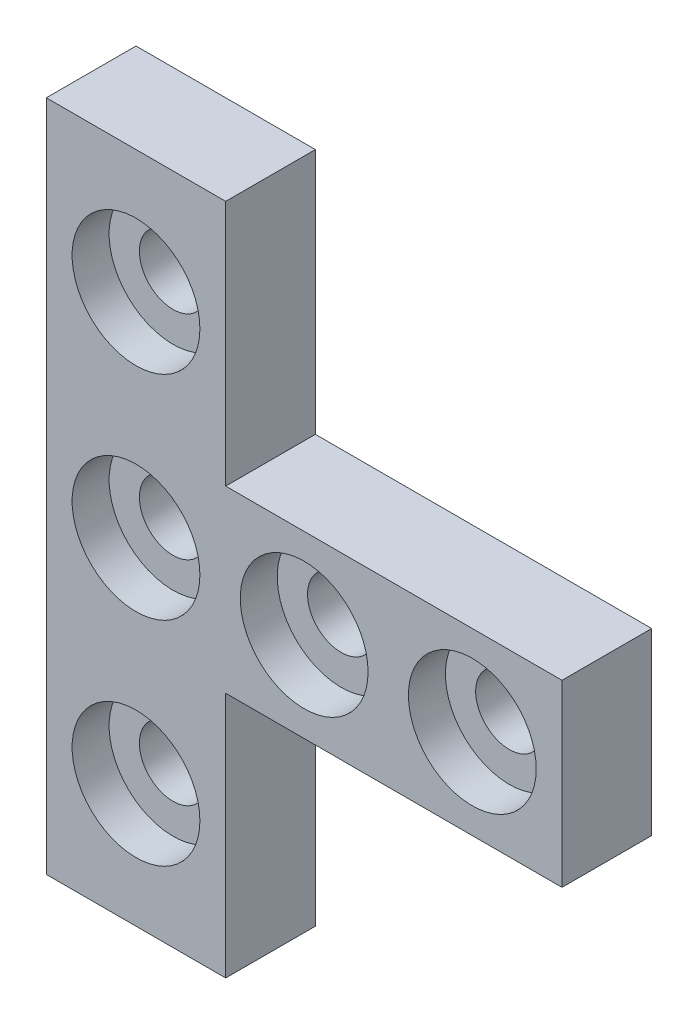
ISO-10303-21;
HEADER;
FILE_DESCRIPTION(('STEP AP214'),'2;1');
FILE_NAME('part.step','',(''),(''),'','','');
FILE_SCHEMA(('AUTOMOTIVE_DESIGN { 1 0 10303 214 1 1 1 1 }'));
ENDSEC;
DATA;
#1=APPLICATION_CONTEXT('core data for automotive mechanical design processes');
#2=APPLICATION_PROTOCOL_DEFINITION('international standard','automotive_design',2000,#1);
#3=PRODUCT_CONTEXT('',#1,'mechanical');
#4=PRODUCT('Part','Part','',(#3));
#5=PRODUCT_RELATED_PRODUCT_CATEGORY('part','',(#4));
#6=PRODUCT_DEFINITION_FORMATION('','',#4);
#7=PRODUCT_DEFINITION_CONTEXT('part definition',#1,'design');
#8=PRODUCT_DEFINITION('design','',#6,#7);
#9=PRODUCT_DEFINITION_SHAPE('','',#8);
#10=(LENGTH_UNIT() NAMED_UNIT(*) SI_UNIT(.MILLI.,.METRE.));
#11=(NAMED_UNIT(*) PLANE_ANGLE_UNIT() SI_UNIT($,.RADIAN.));
#12=(NAMED_UNIT(*) SI_UNIT($,.STERADIAN.) SOLID_ANGLE_UNIT());
#13=UNCERTAINTY_MEASURE_WITH_UNIT(LENGTH_MEASURE(1.E-05),#10,'distance_accuracy_value','');
#14=(GEOMETRIC_REPRESENTATION_CONTEXT(3) GLOBAL_UNCERTAINTY_ASSIGNED_CONTEXT((#13)) GLOBAL_UNIT_ASSIGNED_CONTEXT((#10,
#11,#12)) REPRESENTATION_CONTEXT('',''));
#15=CARTESIAN_POINT('',(0.,0.,0.));
#16=DIRECTION('',(0.,0.,1.));
#17=DIRECTION('',(1.,0.,0.));
#18=AXIS2_PLACEMENT_3D('',#15,#16,#17);
#19=CARTESIAN_POINT('',(49.9972172088586,-189.705431529691,4.));
#20=DIRECTION('',(0.,0.,-1.));
#21=DIRECTION('',(-1.,0.,0.));
#22=AXIS2_PLACEMENT_3D('',#19,#20,#21);
#23=CYLINDRICAL_SURFACE('',#22,1.5);
#24=CARTESIAN_POINT('',(49.9972172088586,-189.705431529691,0.));
#25=DIRECTION('',(0.,0.,1.));
#26=DIRECTION('',(1.,0.,0.));
#27=AXIS2_PLACEMENT_3D('',#24,#25,#26);
#28=CIRCLE('',#27,1.5);
#29=CARTESIAN_POINT('',(51.4972172088586,-189.705431529691,0.));
#30=VERTEX_POINT('',#29);
#31=EDGE_CURVE('E156',#30,#30,#28,.T.);
#32=ORIENTED_EDGE('',*,*,#31,.F.);
#33=EDGE_LOOP('',(#32));
#34=FACE_BOUND('',#33,.T.);
#35=CARTESIAN_POINT('',(49.9972172088586,-189.705431529691,2.35));
#36=DIRECTION('',(0.,0.,1.));
#37=DIRECTION('',(1.,0.,0.));
#38=AXIS2_PLACEMENT_3D('',#35,#36,#37);
#39=CIRCLE('',#38,1.5);
#40=CARTESIAN_POINT('',(51.4972172088586,-189.705431529691,2.35));
#41=VERTEX_POINT('',#40);
#42=EDGE_CURVE('E39',#41,#41,#39,.T.);
#43=ORIENTED_EDGE('',*,*,#42,.T.);
#44=EDGE_LOOP('',(#43));
#45=FACE_BOUND('',#44,.T.);
#46=ADVANCED_FACE('F35',(#34,#45),#23,.F.);
#47=CARTESIAN_POINT('',(42.4972172088585,-180.205431529691,4.));
#48=DIRECTION('',(0.,0.,-1.));
#49=DIRECTION('',(-1.,0.,0.));
#50=AXIS2_PLACEMENT_3D('',#47,#48,#49);
#51=CYLINDRICAL_SURFACE('',#50,1.5);
#52=CARTESIAN_POINT('',(42.4972172088585,-180.205431529691,0.));
#53=DIRECTION('',(0.,0.,1.));
#54=DIRECTION('',(1.,0.,0.));
#55=AXIS2_PLACEMENT_3D('',#52,#53,#54);
#56=CIRCLE('',#55,1.5);
#57=CARTESIAN_POINT('',(43.9972172088585,-180.205431529691,0.));
#58=VERTEX_POINT('',#57);
#59=EDGE_CURVE('E153',#58,#58,#56,.T.);
#60=ORIENTED_EDGE('',*,*,#59,.F.);
#61=EDGE_LOOP('',(#60));
#62=FACE_BOUND('',#61,.T.);
#63=CARTESIAN_POINT('',(42.4972172088585,-180.205431529691,2.35));
#64=DIRECTION('',(0.,0.,1.));
#65=DIRECTION('',(1.,0.,0.));
#66=AXIS2_PLACEMENT_3D('',#63,#64,#65);
#67=CIRCLE('',#66,1.5);
#68=CARTESIAN_POINT('',(43.9972172088585,-180.205431529691,2.35));
#69=VERTEX_POINT('',#68);
#70=EDGE_CURVE('E182',#69,#69,#67,.T.);
#71=ORIENTED_EDGE('',*,*,#70,.T.);
#72=EDGE_LOOP('',(#71));
#73=FACE_BOUND('',#72,.T.);
#74=ADVANCED_FACE('F254',(#62,#73),#51,.F.);
#75=CARTESIAN_POINT('',(42.4972172088585,-199.205431529692,4.));
#76=DIRECTION('',(0.,0.,-1.));
#77=DIRECTION('',(-1.,0.,0.));
#78=AXIS2_PLACEMENT_3D('',#75,#76,#77);
#79=CYLINDRICAL_SURFACE('',#78,1.5);
#80=CARTESIAN_POINT('',(42.4972172088585,-199.205431529692,0.));
#81=DIRECTION('',(0.,0.,1.));
#82=DIRECTION('',(1.,0.,0.));
#83=AXIS2_PLACEMENT_3D('',#80,#81,#82);
#84=CIRCLE('',#83,1.5);
#85=CARTESIAN_POINT('',(43.9972172088585,-199.205431529692,0.));
#86=VERTEX_POINT('',#85);
#87=EDGE_CURVE('E150',#86,#86,#84,.T.);
#88=ORIENTED_EDGE('',*,*,#87,.F.);
#89=EDGE_LOOP('',(#88));
#90=FACE_BOUND('',#89,.T.);
#91=CARTESIAN_POINT('',(42.4972172088585,-199.205431529692,2.35));
#92=DIRECTION('',(0.,0.,1.));
#93=DIRECTION('',(1.,0.,0.));
#94=AXIS2_PLACEMENT_3D('',#91,#92,#93);
#95=CIRCLE('',#94,1.5);
#96=CARTESIAN_POINT('',(43.9972172088585,-199.205431529692,2.35));
#97=VERTEX_POINT('',#96);
#98=EDGE_CURVE('E180',#97,#97,#95,.T.);
#99=ORIENTED_EDGE('',*,*,#98,.T.);
#100=EDGE_LOOP('',(#99));
#101=FACE_BOUND('',#100,.T.);
#102=ADVANCED_FACE('F260',(#90,#101),#79,.F.);
#103=CARTESIAN_POINT('',(42.4972172088586,-189.705431529691,4.));
#104=DIRECTION('',(0.,0.,-1.));
#105=DIRECTION('',(-1.,0.,0.));
#106=AXIS2_PLACEMENT_3D('',#103,#104,#105);
#107=CYLINDRICAL_SURFACE('',#106,1.5);
#108=CARTESIAN_POINT('',(42.4972172088586,-189.705431529691,0.));
#109=DIRECTION('',(0.,0.,1.));
#110=DIRECTION('',(1.,0.,0.));
#111=AXIS2_PLACEMENT_3D('',#108,#109,#110);
#112=CIRCLE('',#111,1.5);
#113=CARTESIAN_POINT('',(43.9972172088586,-189.705431529691,0.));
#114=VERTEX_POINT('',#113);
#115=EDGE_CURVE('E147',#114,#114,#112,.T.);
#116=ORIENTED_EDGE('',*,*,#115,.F.);
#117=EDGE_LOOP('',(#116));
#118=FACE_BOUND('',#117,.T.);
#119=CARTESIAN_POINT('',(42.4972172088586,-189.705431529691,2.35));
#120=DIRECTION('',(0.,0.,1.));
#121=DIRECTION('',(1.,0.,0.));
#122=AXIS2_PLACEMENT_3D('',#119,#120,#121);
#123=CIRCLE('',#122,1.5);
#124=CARTESIAN_POINT('',(43.9972172088586,-189.705431529691,2.35));
#125=VERTEX_POINT('',#124);
#126=EDGE_CURVE('E176',#125,#125,#123,.T.);
#127=ORIENTED_EDGE('',*,*,#126,.T.);
#128=EDGE_LOOP('',(#127));
#129=FACE_BOUND('',#128,.T.);
#130=ADVANCED_FACE('F270',(#118,#129),#107,.F.);
#131=CARTESIAN_POINT('',(57.4972172088586,-189.705431529691,4.));
#132=DIRECTION('',(0.,0.,-1.));
#133=DIRECTION('',(-1.,0.,0.));
#134=AXIS2_PLACEMENT_3D('',#131,#132,#133);
#135=CYLINDRICAL_SURFACE('',#134,1.5);
#136=CARTESIAN_POINT('',(57.4972172088586,-189.705431529691,0.));
#137=DIRECTION('',(0.,0.,1.));
#138=DIRECTION('',(1.,0.,0.));
#139=AXIS2_PLACEMENT_3D('',#136,#137,#138);
#140=CIRCLE('',#139,1.5);
#141=CARTESIAN_POINT('',(58.9972172088586,-189.705431529691,0.));
#142=VERTEX_POINT('',#141);
#143=EDGE_CURVE('E159',#142,#142,#140,.T.);
#144=ORIENTED_EDGE('',*,*,#143,.F.);
#145=EDGE_LOOP('',(#144));
#146=FACE_BOUND('',#145,.T.);
#147=CARTESIAN_POINT('',(57.4972172088586,-189.705431529691,2.35));
#148=DIRECTION('',(0.,0.,1.));
#149=DIRECTION('',(1.,0.,0.));
#150=AXIS2_PLACEMENT_3D('',#147,#148,#149);
#151=CIRCLE('',#150,1.5);
#152=CARTESIAN_POINT('',(58.9972172088586,-189.705431529691,2.35));
#153=VERTEX_POINT('',#152);
#154=EDGE_CURVE('E173',#153,#153,#151,.T.);
#155=ORIENTED_EDGE('',*,*,#154,.T.);
#156=EDGE_LOOP('',(#155));
#157=FACE_BOUND('',#156,.T.);
#158=ADVANCED_FACE('F265',(#146,#157),#135,.F.);
#159=CARTESIAN_POINT('',(3.43624076470357E-13,-185.705431529692,4.));
#160=DIRECTION('',(0.,1.,0.));
#161=DIRECTION('',(-1.,0.,0.));
#162=AXIS2_PLACEMENT_3D('',#159,#160,#161);
#163=PLANE('',#162);
#164=DIRECTION('',(1.,0.,0.));
#165=VECTOR('',#164,1.);
#166=CARTESIAN_POINT('',(3.43624076470357E-13,-185.705431529692,0.));
#167=LINE('',#166,#165);
#168=CARTESIAN_POINT('',(46.4972172088586,-185.705431529692,0.));
#169=VERTEX_POINT('',#168);
#170=CARTESIAN_POINT('',(61.4972172088586,-185.705431529691,0.));
#171=VERTEX_POINT('',#170);
#172=EDGE_CURVE('E130',#169,#171,#167,.T.);
#173=ORIENTED_EDGE('',*,*,#172,.F.);
#174=DIRECTION('',(0.,0.,-1.));
#175=VECTOR('',#174,1.);
#176=CARTESIAN_POINT('',(46.4972172088586,-185.705431529692,4.));
#177=LINE('',#176,#175);
#178=CARTESIAN_POINT('',(46.4972172088586,-185.705431529692,4.));
#179=VERTEX_POINT('',#178);
#180=EDGE_CURVE('E11',#179,#169,#177,.T.);
#181=ORIENTED_EDGE('',*,*,#180,.F.);
#182=DIRECTION('',(1.,0.,0.));
#183=VECTOR('',#182,1.);
#184=CARTESIAN_POINT('',(3.43624076470357E-13,-185.705431529692,4.));
#185=LINE('',#184,#183);
#186=CARTESIAN_POINT('',(61.4972172088586,-185.705431529691,4.));
#187=VERTEX_POINT('',#186);
#188=EDGE_CURVE('E162',#179,#187,#185,.T.);
#189=ORIENTED_EDGE('',*,*,#188,.T.);
#190=DIRECTION('',(0.,0.,-1.));
#191=VECTOR('',#190,1.);
#192=CARTESIAN_POINT('',(61.4972172088586,-185.705431529691,4.));
#193=LINE('',#192,#191);
#194=EDGE_CURVE('E89',#187,#171,#193,.T.);
#195=ORIENTED_EDGE('',*,*,#194,.T.);
#196=EDGE_LOOP('',(#173,#181,#189,#195));
#197=FACE_BOUND('',#196,.T.);
#198=ADVANCED_FACE('F37',(#197),#163,.T.);
#199=CARTESIAN_POINT('',(46.4972172088586,0.,4.));
#200=DIRECTION('',(-1.,0.,0.));
#201=DIRECTION('',(0.,0.,1.));
#202=AXIS2_PLACEMENT_3D('',#199,#200,#201);
#203=PLANE('',#202);
#204=DIRECTION('',(0.,1.,0.));
#205=VECTOR('',#204,1.);
#206=CARTESIAN_POINT('',(46.4972172088586,0.,0.));
#207=LINE('',#206,#205);
#208=CARTESIAN_POINT('',(46.4972172088584,-174.705431529691,0.));
#209=VERTEX_POINT('',#208);
#210=EDGE_CURVE('E133',#169,#209,#207,.T.);
#211=ORIENTED_EDGE('',*,*,#210,.T.);
#212=DIRECTION('',(0.,0.,-1.));
#213=VECTOR('',#212,1.);
#214=CARTESIAN_POINT('',(46.4972172088584,-174.705431529691,4.));
#215=LINE('',#214,#213);
#216=CARTESIAN_POINT('',(46.4972172088584,-174.705431529691,4.));
#217=VERTEX_POINT('',#216);
#218=EDGE_CURVE('E45',#217,#209,#215,.T.);
#219=ORIENTED_EDGE('',*,*,#218,.F.);
#220=DIRECTION('',(0.,1.,0.));
#221=VECTOR('',#220,1.);
#222=CARTESIAN_POINT('',(46.4972172088586,0.,4.));
#223=LINE('',#222,#221);
#224=EDGE_CURVE('E217',#179,#217,#223,.T.);
#225=ORIENTED_EDGE('',*,*,#224,.F.);
#226=ORIENTED_EDGE('',*,*,#180,.T.);
#227=EDGE_LOOP('',(#211,#219,#225,#226));
#228=FACE_BOUND('',#227,.T.);
#229=ADVANCED_FACE('F238',(#228),#203,.F.);
#230=CARTESIAN_POINT('',(0.,-174.705431529691,4.));
#231=DIRECTION('',(0.,-1.,0.));
#232=DIRECTION('',(0.,0.,-1.));
#233=AXIS2_PLACEMENT_3D('',#230,#231,#232);
#234=PLANE('',#233);
#235=DIRECTION('',(-1.,0.,0.));
#236=VECTOR('',#235,1.);
#237=CARTESIAN_POINT('',(0.,-174.705431529691,0.));
#238=LINE('',#237,#236);
#239=CARTESIAN_POINT('',(38.4972172088586,-174.705431529691,0.));
#240=VERTEX_POINT('',#239);
#241=EDGE_CURVE('E135',#209,#240,#238,.T.);
#242=ORIENTED_EDGE('',*,*,#241,.T.);
#243=DIRECTION('',(0.,0.,-1.));
#244=VECTOR('',#243,1.);
#245=CARTESIAN_POINT('',(38.4972172088586,-174.705431529691,4.));
#246=LINE('',#245,#244);
#247=CARTESIAN_POINT('',(38.4972172088586,-174.705431529691,4.));
#248=VERTEX_POINT('',#247);
#249=EDGE_CURVE('E168',#248,#240,#246,.T.);
#250=ORIENTED_EDGE('',*,*,#249,.F.);
#251=DIRECTION('',(-1.,0.,0.));
#252=VECTOR('',#251,1.);
#253=CARTESIAN_POINT('',(0.,-174.705431529691,4.));
#254=LINE('',#253,#252);
#255=EDGE_CURVE('E219',#217,#248,#254,.T.);
#256=ORIENTED_EDGE('',*,*,#255,.F.);
#257=ORIENTED_EDGE('',*,*,#218,.T.);
#258=EDGE_LOOP('',(#242,#250,#256,#257));
#259=FACE_BOUND('',#258,.T.);
#260=ADVANCED_FACE('F241',(#259),#234,.F.);
#261=CARTESIAN_POINT('',(38.4972172088584,0.,4.));
#262=DIRECTION('',(1.,0.,0.));
#263=DIRECTION('',(0.,1.,0.));
#264=AXIS2_PLACEMENT_3D('',#261,#262,#263);
#265=PLANE('',#264);
#266=DIRECTION('',(0.,-1.,0.));
#267=VECTOR('',#266,1.);
#268=CARTESIAN_POINT('',(38.4972172088584,0.,0.));
#269=LINE('',#268,#267);
#270=CARTESIAN_POINT('',(38.4972172088586,-204.705431529692,0.));
#271=VERTEX_POINT('',#270);
#272=EDGE_CURVE('E137',#240,#271,#269,.T.);
#273=ORIENTED_EDGE('',*,*,#272,.T.);
#274=DIRECTION('',(0.,0.,-1.));
#275=VECTOR('',#274,1.);
#276=CARTESIAN_POINT('',(38.4972172088586,-204.705431529692,4.));
#277=LINE('',#276,#275);
#278=CARTESIAN_POINT('',(38.4972172088586,-204.705431529692,4.));
#279=VERTEX_POINT('',#278);
#280=EDGE_CURVE('E166',#279,#271,#277,.T.);
#281=ORIENTED_EDGE('',*,*,#280,.F.);
#282=DIRECTION('',(0.,-1.,0.));
#283=VECTOR('',#282,1.);
#284=CARTESIAN_POINT('',(38.4972172088584,0.,4.));
#285=LINE('',#284,#283);
#286=EDGE_CURVE('E221',#248,#279,#285,.T.);
#287=ORIENTED_EDGE('',*,*,#286,.F.);
#288=ORIENTED_EDGE('',*,*,#249,.T.);
#289=EDGE_LOOP('',(#273,#281,#287,#288));
#290=FACE_BOUND('',#289,.T.);
#291=ADVANCED_FACE('F244',(#290),#265,.F.);
#292=CARTESIAN_POINT('',(0.,-204.705431529692,4.));
#293=DIRECTION('',(0.,-1.,0.));
#294=DIRECTION('',(0.,0.,-1.));
#295=AXIS2_PLACEMENT_3D('',#292,#293,#294);
#296=PLANE('',#295);
#297=DIRECTION('',(-1.,0.,0.));
#298=VECTOR('',#297,1.);
#299=CARTESIAN_POINT('',(0.,-204.705431529692,0.));
#300=LINE('',#299,#298);
#301=CARTESIAN_POINT('',(46.4972172088584,-204.705431529692,0.));
#302=VERTEX_POINT('',#301);
#303=EDGE_CURVE('E140',#302,#271,#300,.T.);
#304=ORIENTED_EDGE('',*,*,#303,.F.);
#305=DIRECTION('',(0.,0.,-1.));
#306=VECTOR('',#305,1.);
#307=CARTESIAN_POINT('',(46.4972172088584,-204.705431529692,4.));
#308=LINE('',#307,#306);
#309=CARTESIAN_POINT('',(46.4972172088584,-204.705431529692,4.));
#310=VERTEX_POINT('',#309);
#311=EDGE_CURVE('E122',#310,#302,#308,.T.);
#312=ORIENTED_EDGE('',*,*,#311,.F.);
#313=DIRECTION('',(-1.,0.,0.));
#314=VECTOR('',#313,1.);
#315=CARTESIAN_POINT('',(0.,-204.705431529692,4.));
#316=LINE('',#315,#314);
#317=EDGE_CURVE('E115',#310,#279,#316,.T.);
#318=ORIENTED_EDGE('',*,*,#317,.T.);
#319=ORIENTED_EDGE('',*,*,#280,.T.);
#320=EDGE_LOOP('',(#304,#312,#318,#319));
#321=FACE_BOUND('',#320,.T.);
#322=ADVANCED_FACE('F224',(#321),#296,.T.);
#323=CARTESIAN_POINT('',(46.497217208861,-5.86616830980391E-13,4.));
#324=DIRECTION('',(-1.,0.,0.));
#325=DIRECTION('',(0.,-1.,0.));
#326=AXIS2_PLACEMENT_3D('',#323,#324,#325);
#327=PLANE('',#326);
#328=DIRECTION('',(0.,1.,0.));
#329=VECTOR('',#328,1.);
#330=CARTESIAN_POINT('',(46.497217208861,-5.86616830980391E-13,0.));
#331=LINE('',#330,#329);
#332=CARTESIAN_POINT('',(46.4972172088586,-193.705431529691,0.));
#333=VERTEX_POINT('',#332);
#334=EDGE_CURVE('E121',#302,#333,#331,.T.);
#335=ORIENTED_EDGE('',*,*,#334,.T.);
#336=DIRECTION('',(0.,0.,-1.));
#337=VECTOR('',#336,1.);
#338=CARTESIAN_POINT('',(46.4972172088586,-193.705431529691,4.));
#339=LINE('',#338,#337);
#340=CARTESIAN_POINT('',(46.4972172088586,-193.705431529691,4.));
#341=VERTEX_POINT('',#340);
#342=EDGE_CURVE('E118',#341,#333,#339,.T.);
#343=ORIENTED_EDGE('',*,*,#342,.F.);
#344=DIRECTION('',(0.,1.,0.));
#345=VECTOR('',#344,1.);
#346=CARTESIAN_POINT('',(46.497217208861,-5.86616830980391E-13,4.));
#347=LINE('',#346,#345);
#348=EDGE_CURVE('E109',#310,#341,#347,.T.);
#349=ORIENTED_EDGE('',*,*,#348,.F.);
#350=ORIENTED_EDGE('',*,*,#311,.T.);
#351=EDGE_LOOP('',(#335,#343,#349,#350));
#352=FACE_BOUND('',#351,.T.);
#353=ADVANCED_FACE('F119',(#352),#327,.F.);
#354=CARTESIAN_POINT('',(-3.58427050132025E-13,-193.705431529691,4.));
#355=DIRECTION('',(0.,1.,0.));
#356=DIRECTION('',(-1.,0.,0.));
#357=AXIS2_PLACEMENT_3D('',#354,#355,#356);
#358=PLANE('',#357);
#359=DIRECTION('',(1.,0.,0.));
#360=VECTOR('',#359,1.);
#361=CARTESIAN_POINT('',(-3.58427050132025E-13,-193.705431529691,0.));
#362=LINE('',#361,#360);
#363=CARTESIAN_POINT('',(61.4972172088586,-193.705431529692,0.));
#364=VERTEX_POINT('',#363);
#365=EDGE_CURVE('E82',#333,#364,#362,.T.);
#366=ORIENTED_EDGE('',*,*,#365,.T.);
#367=DIRECTION('',(0.,0.,-1.));
#368=VECTOR('',#367,1.);
#369=CARTESIAN_POINT('',(61.4972172088586,-193.705431529692,4.));
#370=LINE('',#369,#368);
#371=CARTESIAN_POINT('',(61.4972172088586,-193.705431529692,4.));
#372=VERTEX_POINT('',#371);
#373=EDGE_CURVE('E123',#372,#364,#370,.T.);
#374=ORIENTED_EDGE('',*,*,#373,.F.);
#375=DIRECTION('',(1.,0.,0.));
#376=VECTOR('',#375,1.);
#377=CARTESIAN_POINT('',(-3.58427050132025E-13,-193.705431529691,4.));
#378=LINE('',#377,#376);
#379=EDGE_CURVE('E113',#341,#372,#378,.T.);
#380=ORIENTED_EDGE('',*,*,#379,.F.);
#381=ORIENTED_EDGE('',*,*,#342,.T.);
#382=EDGE_LOOP('',(#366,#374,#380,#381));
#383=FACE_BOUND('',#382,.T.);
#384=ADVANCED_FACE('F125',(#383),#358,.F.);
#385=CARTESIAN_POINT('',(61.4972172088586,0.,4.));
#386=DIRECTION('',(-1.,0.,0.));
#387=DIRECTION('',(0.,0.,1.));
#388=AXIS2_PLACEMENT_3D('',#385,#386,#387);
#389=PLANE('',#388);
#390=DIRECTION('',(0.,1.,0.));
#391=VECTOR('',#390,1.);
#392=CARTESIAN_POINT('',(61.4972172088586,0.,0.));
#393=LINE('',#392,#391);
#394=EDGE_CURVE('E145',#364,#171,#393,.T.);
#395=ORIENTED_EDGE('',*,*,#394,.T.);
#396=ORIENTED_EDGE('',*,*,#194,.F.);
#397=DIRECTION('',(0.,1.,0.));
#398=VECTOR('',#397,1.);
#399=CARTESIAN_POINT('',(61.4972172088586,0.,4.));
#400=LINE('',#399,#398);
#401=EDGE_CURVE('E54',#372,#187,#400,.T.);
#402=ORIENTED_EDGE('',*,*,#401,.F.);
#403=ORIENTED_EDGE('',*,*,#373,.T.);
#404=EDGE_LOOP('',(#395,#396,#402,#403));
#405=FACE_BOUND('',#404,.T.);
#406=ADVANCED_FACE('F233',(#405),#389,.F.);
#407=CARTESIAN_POINT('',(0.,0.,4.));
#408=DIRECTION('',(0.,0.,1.));
#409=DIRECTION('',(1.,0.,0.));
#410=AXIS2_PLACEMENT_3D('',#407,#408,#409);
#411=PLANE('',#410);
#412=CARTESIAN_POINT('',(42.4972172088585,-199.205431529692,4.));
#413=DIRECTION('',(0.,0.,1.));
#414=DIRECTION('',(1.,0.,0.));
#415=AXIS2_PLACEMENT_3D('',#412,#413,#414);
#416=CIRCLE('',#415,2.85);
#417=CARTESIAN_POINT('',(45.3472172088585,-199.205431529692,4.));
#418=VERTEX_POINT('',#417);
#419=EDGE_CURVE('E501',#418,#418,#416,.T.);
#420=ORIENTED_EDGE('',*,*,#419,.F.);
#421=EDGE_LOOP('',(#420));
#422=FACE_BOUND('',#421,.T.);
#423=CARTESIAN_POINT('',(42.4972172088586,-189.705431529691,4.));
#424=DIRECTION('',(0.,0.,1.));
#425=DIRECTION('',(1.,0.,0.));
#426=AXIS2_PLACEMENT_3D('',#423,#424,#425);
#427=CIRCLE('',#426,2.85);
#428=CARTESIAN_POINT('',(45.3472172088586,-189.705431529691,4.));
#429=VERTEX_POINT('',#428);
#430=EDGE_CURVE('E509',#429,#429,#427,.T.);
#431=ORIENTED_EDGE('',*,*,#430,.F.);
#432=EDGE_LOOP('',(#431));
#433=FACE_BOUND('',#432,.T.);
#434=CARTESIAN_POINT('',(42.4972172088585,-180.205431529691,4.));
#435=DIRECTION('',(0.,0.,1.));
#436=DIRECTION('',(1.,0.,0.));
#437=AXIS2_PLACEMENT_3D('',#434,#435,#436);
#438=CIRCLE('',#437,2.85);
#439=CARTESIAN_POINT('',(45.3472172088585,-180.205431529691,4.));
#440=VERTEX_POINT('',#439);
#441=EDGE_CURVE('E200',#440,#440,#438,.T.);
#442=ORIENTED_EDGE('',*,*,#441,.F.);
#443=EDGE_LOOP('',(#442));
#444=FACE_BOUND('',#443,.T.);
#445=CARTESIAN_POINT('',(49.9972172088586,-189.705431529691,4.));
#446=DIRECTION('',(0.,0.,1.));
#447=DIRECTION('',(1.,0.,0.));
#448=AXIS2_PLACEMENT_3D('',#445,#446,#447);
#449=CIRCLE('',#448,2.85);
#450=CARTESIAN_POINT('',(52.8472172088586,-189.705431529691,4.));
#451=VERTEX_POINT('',#450);
#452=EDGE_CURVE('E201',#451,#451,#449,.T.);
#453=ORIENTED_EDGE('',*,*,#452,.F.);
#454=EDGE_LOOP('',(#453));
#455=FACE_BOUND('',#454,.T.);
#456=CARTESIAN_POINT('',(57.4972172088586,-189.705431529691,4.));
#457=DIRECTION('',(0.,0.,1.));
#458=DIRECTION('',(1.,0.,0.));
#459=AXIS2_PLACEMENT_3D('',#456,#457,#458);
#460=CIRCLE('',#459,2.85);
#461=CARTESIAN_POINT('',(60.3472172088586,-189.705431529691,4.));
#462=VERTEX_POINT('',#461);
#463=EDGE_CURVE('E213',#462,#462,#460,.T.);
#464=ORIENTED_EDGE('',*,*,#463,.F.);
#465=EDGE_LOOP('',(#464));
#466=FACE_BOUND('',#465,.T.);
#467=ORIENTED_EDGE('',*,*,#188,.F.);
#468=ORIENTED_EDGE('',*,*,#224,.T.);
#469=ORIENTED_EDGE('',*,*,#255,.T.);
#470=ORIENTED_EDGE('',*,*,#286,.T.);
#471=ORIENTED_EDGE('',*,*,#317,.F.);
#472=ORIENTED_EDGE('',*,*,#348,.T.);
#473=ORIENTED_EDGE('',*,*,#379,.T.);
#474=ORIENTED_EDGE('',*,*,#401,.T.);
#475=EDGE_LOOP('',(#467,#468,#469,#470,#471,#472,#473,#474));
#476=FACE_BOUND('',#475,.T.);
#477=ADVANCED_FACE('F111',(#422,#433,#444,#455,#466,#476),#411,.T.);
#478=CARTESIAN_POINT('',(0.,0.,0.));
#479=DIRECTION('',(0.,0.,1.));
#480=DIRECTION('',(1.,0.,0.));
#481=AXIS2_PLACEMENT_3D('',#478,#479,#480);
#482=PLANE('',#481);
#483=ORIENTED_EDGE('',*,*,#172,.T.);
#484=ORIENTED_EDGE('',*,*,#394,.F.);
#485=ORIENTED_EDGE('',*,*,#365,.F.);
#486=ORIENTED_EDGE('',*,*,#334,.F.);
#487=ORIENTED_EDGE('',*,*,#303,.T.);
#488=ORIENTED_EDGE('',*,*,#272,.F.);
#489=ORIENTED_EDGE('',*,*,#241,.F.);
#490=ORIENTED_EDGE('',*,*,#210,.F.);
#491=EDGE_LOOP('',(#483,#484,#485,#486,#487,#488,#489,#490));
#492=FACE_BOUND('',#491,.T.);
#493=ORIENTED_EDGE('',*,*,#115,.T.);
#494=EDGE_LOOP('',(#493));
#495=FACE_BOUND('',#494,.T.);
#496=ORIENTED_EDGE('',*,*,#87,.T.);
#497=EDGE_LOOP('',(#496));
#498=FACE_BOUND('',#497,.T.);
#499=ORIENTED_EDGE('',*,*,#59,.T.);
#500=EDGE_LOOP('',(#499));
#501=FACE_BOUND('',#500,.T.);
#502=ORIENTED_EDGE('',*,*,#31,.T.);
#503=EDGE_LOOP('',(#502));
#504=FACE_BOUND('',#503,.T.);
#505=ORIENTED_EDGE('',*,*,#143,.T.);
#506=EDGE_LOOP('',(#505));
#507=FACE_BOUND('',#506,.T.);
#508=ADVANCED_FACE('F227',(#492,#495,#498,#501,#504,#507),#482,.F.);
#509=CARTESIAN_POINT('',(57.4972172088586,-189.705431529691,2.35));
#510=DIRECTION('',(0.,0.,1.));
#511=DIRECTION('',(1.,0.,0.));
#512=AXIS2_PLACEMENT_3D('',#509,#510,#511);
#513=CYLINDRICAL_SURFACE('',#512,2.85);
#514=CARTESIAN_POINT('',(57.4972172088586,-189.705431529691,2.35));
#515=DIRECTION('',(0.,0.,1.));
#516=DIRECTION('',(1.,0.,0.));
#517=AXIS2_PLACEMENT_3D('',#514,#515,#516);
#518=CIRCLE('',#517,2.85);
#519=CARTESIAN_POINT('',(60.3472172088586,-189.705431529691,2.35));
#520=VERTEX_POINT('',#519);
#521=EDGE_CURVE('E207',#520,#520,#518,.T.);
#522=ORIENTED_EDGE('',*,*,#521,.F.);
#523=EDGE_LOOP('',(#522));
#524=FACE_BOUND('',#523,.T.);
#525=ORIENTED_EDGE('',*,*,#463,.T.);
#526=EDGE_LOOP('',(#525));
#527=FACE_BOUND('',#526,.T.);
#528=ADVANCED_FACE('F307',(#524,#527),#513,.F.);
#529=CARTESIAN_POINT('',(57.4972172088586,-189.705431529691,2.35));
#530=DIRECTION('',(0.,0.,1.));
#531=DIRECTION('',(1.,0.,0.));
#532=AXIS2_PLACEMENT_3D('',#529,#530,#531);
#533=PLANE('',#532);
#534=ORIENTED_EDGE('',*,*,#154,.F.);
#535=EDGE_LOOP('',(#534));
#536=FACE_BOUND('',#535,.T.);
#537=ORIENTED_EDGE('',*,*,#521,.T.);
#538=EDGE_LOOP('',(#537));
#539=FACE_BOUND('',#538,.T.);
#540=ADVANCED_FACE('F312',(#536,#539),#533,.T.);
#541=CARTESIAN_POINT('',(49.9972172088586,-189.705431529691,2.35));
#542=DIRECTION('',(0.,0.,1.));
#543=DIRECTION('',(1.,0.,0.));
#544=AXIS2_PLACEMENT_3D('',#541,#542,#543);
#545=CYLINDRICAL_SURFACE('',#544,2.85);
#546=CARTESIAN_POINT('',(49.9972172088586,-189.705431529691,2.35));
#547=DIRECTION('',(0.,0.,1.));
#548=DIRECTION('',(1.,0.,0.));
#549=AXIS2_PLACEMENT_3D('',#546,#547,#548);
#550=CIRCLE('',#549,2.85);
#551=CARTESIAN_POINT('',(52.8472172088586,-189.705431529691,2.35));
#552=VERTEX_POINT('',#551);
#553=EDGE_CURVE('E198',#552,#552,#550,.T.);
#554=ORIENTED_EDGE('',*,*,#553,.F.);
#555=EDGE_LOOP('',(#554));
#556=FACE_BOUND('',#555,.T.);
#557=ORIENTED_EDGE('',*,*,#452,.T.);
#558=EDGE_LOOP('',(#557));
#559=FACE_BOUND('',#558,.T.);
#560=ADVANCED_FACE('F194',(#556,#559),#545,.F.);
#561=CARTESIAN_POINT('',(49.9972172088586,-189.705431529691,2.35));
#562=DIRECTION('',(0.,0.,1.));
#563=DIRECTION('',(1.,0.,0.));
#564=AXIS2_PLACEMENT_3D('',#561,#562,#563);
#565=PLANE('',#564);
#566=ORIENTED_EDGE('',*,*,#42,.F.);
#567=EDGE_LOOP('',(#566));
#568=FACE_BOUND('',#567,.T.);
#569=ORIENTED_EDGE('',*,*,#553,.T.);
#570=EDGE_LOOP('',(#569));
#571=FACE_BOUND('',#570,.T.);
#572=ADVANCED_FACE('F190',(#568,#571),#565,.T.);
#573=CARTESIAN_POINT('',(42.4972172088585,-180.205431529691,2.35));
#574=DIRECTION('',(0.,0.,1.));
#575=DIRECTION('',(1.,0.,0.));
#576=AXIS2_PLACEMENT_3D('',#573,#574,#575);
#577=CYLINDRICAL_SURFACE('',#576,2.85);
#578=CARTESIAN_POINT('',(42.4972172088585,-180.205431529691,2.35));
#579=DIRECTION('',(0.,0.,1.));
#580=DIRECTION('',(1.,0.,0.));
#581=AXIS2_PLACEMENT_3D('',#578,#579,#580);
#582=CIRCLE('',#581,2.85);
#583=CARTESIAN_POINT('',(45.3472172088585,-180.205431529691,2.35));
#584=VERTEX_POINT('',#583);
#585=EDGE_CURVE('E204',#584,#584,#582,.T.);
#586=ORIENTED_EDGE('',*,*,#585,.F.);
#587=EDGE_LOOP('',(#586));
#588=FACE_BOUND('',#587,.T.);
#589=ORIENTED_EDGE('',*,*,#441,.T.);
#590=EDGE_LOOP('',(#589));
#591=FACE_BOUND('',#590,.T.);
#592=ADVANCED_FACE('F193',(#588,#591),#577,.F.);
#593=CARTESIAN_POINT('',(42.4972172088585,-180.205431529691,2.35));
#594=DIRECTION('',(0.,0.,1.));
#595=DIRECTION('',(1.,0.,0.));
#596=AXIS2_PLACEMENT_3D('',#593,#594,#595);
#597=PLANE('',#596);
#598=ORIENTED_EDGE('',*,*,#70,.F.);
#599=EDGE_LOOP('',(#598));
#600=FACE_BOUND('',#599,.T.);
#601=ORIENTED_EDGE('',*,*,#585,.T.);
#602=EDGE_LOOP('',(#601));
#603=FACE_BOUND('',#602,.T.);
#604=ADVANCED_FACE('F337',(#600,#603),#597,.T.);
#605=CARTESIAN_POINT('',(42.4972172088586,-189.705431529691,2.35));
#606=DIRECTION('',(0.,0.,1.));
#607=DIRECTION('',(1.,0.,0.));
#608=AXIS2_PLACEMENT_3D('',#605,#606,#607);
#609=CYLINDRICAL_SURFACE('',#608,2.85);
#610=CARTESIAN_POINT('',(42.4972172088586,-189.705431529691,2.35));
#611=DIRECTION('',(0.,0.,1.));
#612=DIRECTION('',(1.,0.,0.));
#613=AXIS2_PLACEMENT_3D('',#610,#611,#612);
#614=CIRCLE('',#613,2.85);
#615=CARTESIAN_POINT('',(45.3472172088586,-189.705431529691,2.35));
#616=VERTEX_POINT('',#615);
#617=EDGE_CURVE('E504',#616,#616,#614,.T.);
#618=ORIENTED_EDGE('',*,*,#617,.F.);
#619=EDGE_LOOP('',(#618));
#620=FACE_BOUND('',#619,.T.);
#621=ORIENTED_EDGE('',*,*,#430,.T.);
#622=EDGE_LOOP('',(#621));
#623=FACE_BOUND('',#622,.T.);
#624=ADVANCED_FACE('F345',(#620,#623),#609,.F.);
#625=CARTESIAN_POINT('',(42.4972172088586,-189.705431529691,2.35));
#626=DIRECTION('',(0.,0.,1.));
#627=DIRECTION('',(1.,0.,0.));
#628=AXIS2_PLACEMENT_3D('',#625,#626,#627);
#629=PLANE('',#628);
#630=ORIENTED_EDGE('',*,*,#126,.F.);
#631=EDGE_LOOP('',(#630));
#632=FACE_BOUND('',#631,.T.);
#633=ORIENTED_EDGE('',*,*,#617,.T.);
#634=EDGE_LOOP('',(#633));
#635=FACE_BOUND('',#634,.T.);
#636=ADVANCED_FACE('F353',(#632,#635),#629,.T.);
#637=CARTESIAN_POINT('',(42.4972172088585,-199.205431529692,2.35));
#638=DIRECTION('',(0.,0.,1.));
#639=DIRECTION('',(1.,0.,0.));
#640=AXIS2_PLACEMENT_3D('',#637,#638,#639);
#641=CYLINDRICAL_SURFACE('',#640,2.85);
#642=CARTESIAN_POINT('',(42.4972172088585,-199.205431529692,2.35));
#643=DIRECTION('',(0.,0.,1.));
#644=DIRECTION('',(1.,0.,0.));
#645=AXIS2_PLACEMENT_3D('',#642,#643,#644);
#646=CIRCLE('',#645,2.85);
#647=CARTESIAN_POINT('',(45.3472172088585,-199.205431529692,2.35));
#648=VERTEX_POINT('',#647);
#649=EDGE_CURVE('E177',#648,#648,#646,.T.);
#650=ORIENTED_EDGE('',*,*,#649,.F.);
#651=EDGE_LOOP('',(#650));
#652=FACE_BOUND('',#651,.T.);
#653=ORIENTED_EDGE('',*,*,#419,.T.);
#654=EDGE_LOOP('',(#653));
#655=FACE_BOUND('',#654,.T.);
#656=ADVANCED_FACE('F361',(#652,#655),#641,.F.);
#657=CARTESIAN_POINT('',(42.4972172088585,-199.205431529692,2.35));
#658=DIRECTION('',(0.,0.,1.));
#659=DIRECTION('',(1.,0.,0.));
#660=AXIS2_PLACEMENT_3D('',#657,#658,#659);
#661=PLANE('',#660);
#662=ORIENTED_EDGE('',*,*,#98,.F.);
#663=EDGE_LOOP('',(#662));
#664=FACE_BOUND('',#663,.T.);
#665=ORIENTED_EDGE('',*,*,#649,.T.);
#666=EDGE_LOOP('',(#665));
#667=FACE_BOUND('',#666,.T.);
#668=ADVANCED_FACE('F369',(#664,#667),#661,.T.);
#669=CLOSED_SHELL('',(#46,#74,#102,#130,#158,#198,#229,#260,#291,#322,#353,#384,#406,#477,#508,
#528,#540,#560,#572,#592,#604,#624,#636,#656,#668));
#670=MANIFOLD_SOLID_BREP('B2',#669);
#671=ADVANCED_BREP_SHAPE_REPRESENTATION('',(#18,#670),#14);
#672=SHAPE_DEFINITION_REPRESENTATION(#9,#671);
ENDSEC;
END-ISO-10303-21;
